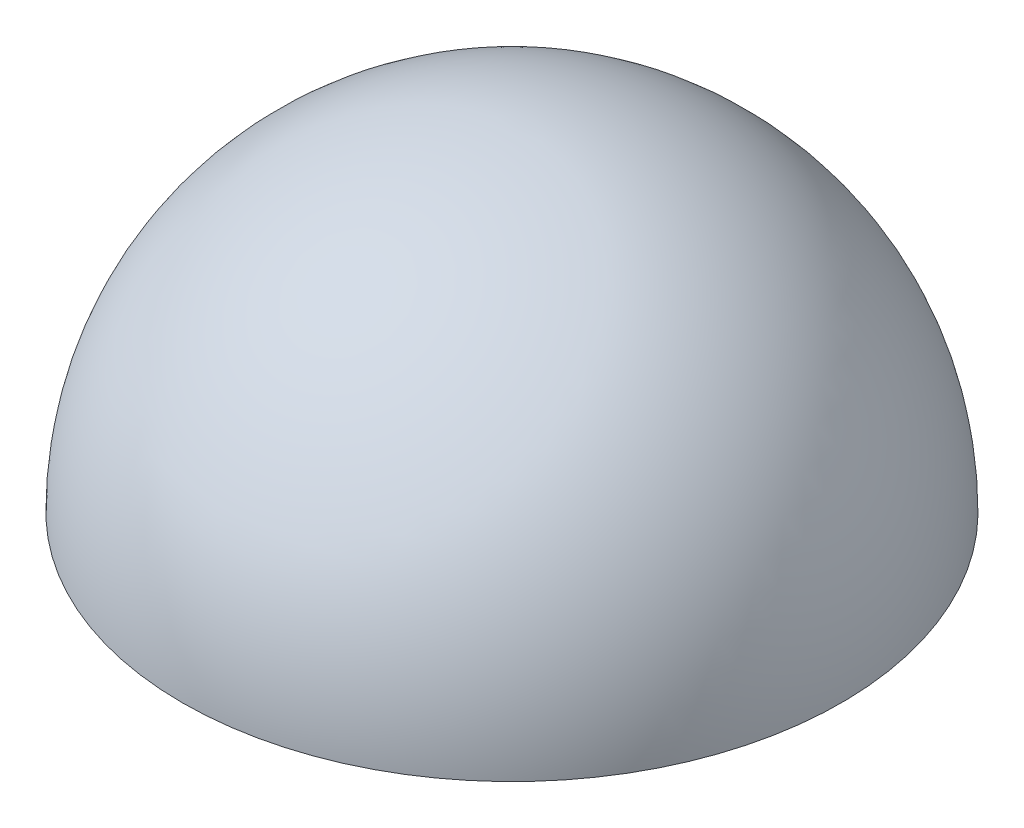
ISO-10303-21;
HEADER;
FILE_DESCRIPTION(('STEP AP214'),'2;1');
FILE_NAME('part.step','',(''),(''),'','','');
FILE_SCHEMA(('AUTOMOTIVE_DESIGN { 1 0 10303 214 1 1 1 1 }'));
ENDSEC;
DATA;
#1=APPLICATION_CONTEXT('core data for automotive mechanical design processes');
#2=APPLICATION_PROTOCOL_DEFINITION('international standard','automotive_design',2000,#1);
#3=PRODUCT_CONTEXT('',#1,'mechanical');
#4=PRODUCT('Part','Part','',(#3));
#5=PRODUCT_RELATED_PRODUCT_CATEGORY('part','',(#4));
#6=PRODUCT_DEFINITION_FORMATION('','',#4);
#7=PRODUCT_DEFINITION_CONTEXT('part definition',#1,'design');
#8=PRODUCT_DEFINITION('design','',#6,#7);
#9=PRODUCT_DEFINITION_SHAPE('','',#8);
#10=(LENGTH_UNIT() NAMED_UNIT(*) SI_UNIT(.MILLI.,.METRE.));
#11=(NAMED_UNIT(*) PLANE_ANGLE_UNIT() SI_UNIT($,.RADIAN.));
#12=(NAMED_UNIT(*) SI_UNIT($,.STERADIAN.) SOLID_ANGLE_UNIT());
#13=UNCERTAINTY_MEASURE_WITH_UNIT(LENGTH_MEASURE(1.E-05),#10,'distance_accuracy_value','');
#14=(GEOMETRIC_REPRESENTATION_CONTEXT(3) GLOBAL_UNCERTAINTY_ASSIGNED_CONTEXT((#13)) GLOBAL_UNIT_ASSIGNED_CONTEXT((#10,
#11,#12)) REPRESENTATION_CONTEXT('',''));
#15=CARTESIAN_POINT('',(0.,0.,0.));
#16=DIRECTION('',(0.,0.,1.));
#17=DIRECTION('',(1.,0.,0.));
#18=AXIS2_PLACEMENT_3D('',#15,#16,#17);
#19=CARTESIAN_POINT('',(25.,0.,0.));
#20=DIRECTION('',(-1.,0.,0.));
#21=DIRECTION('',(0.,0.,1.));
#22=AXIS2_PLACEMENT_3D('',#19,#20,#21);
#23=SPHERICAL_SURFACE('',#22,25.);
#24=CARTESIAN_POINT('',(25.,0.,0.));
#25=DIRECTION('',(0.,-1.,0.));
#26=DIRECTION('',(0.,0.,1.));
#27=AXIS2_PLACEMENT_3D('',#24,#25,#26);
#28=SPHERICAL_SURFACE('',#27,25.);
#29=CARTESIAN_POINT('',(25.,0.,0.));
#30=DIRECTION('',(0.,-1.,0.));
#31=DIRECTION('',(0.,0.,1.));
#32=AXIS2_PLACEMENT_3D('',#29,#30,#31);
#33=CIRCLE('',#32,25.);
#34=CARTESIAN_POINT('',(25.,-1.74574066942157E-13,25.));
#35=VERTEX_POINT('',#34);
#36=EDGE_CURVE('E10',#35,#35,#33,.T.);
#37=ORIENTED_EDGE('',*,*,#36,.F.);
#38=EDGE_LOOP('',(#37));
#39=FACE_BOUND('',#38,.T.);
#40=ADVANCED_FACE('F29',(#39),#28,.T.);
#41=CARTESIAN_POINT('',(25.,0.,0.));
#42=DIRECTION('',(0.,1.,0.));
#43=DIRECTION('',(0.,0.,1.));
#44=AXIS2_PLACEMENT_3D('',#41,#42,#43);
#45=PLANE('',#44);
#46=ORIENTED_EDGE('',*,*,#36,.T.);
#47=EDGE_LOOP('',(#46));
#48=FACE_BOUND('',#47,.T.);
#49=ADVANCED_FACE('F36',(#48),#45,.F.);
#50=CLOSED_SHELL('',(#40,#49));
#51=MANIFOLD_SOLID_BREP('B2',#50);
#52=ADVANCED_BREP_SHAPE_REPRESENTATION('',(#18,#51),#14);
#53=SHAPE_DEFINITION_REPRESENTATION(#9,#52);
ENDSEC;
END-ISO-10303-21;
